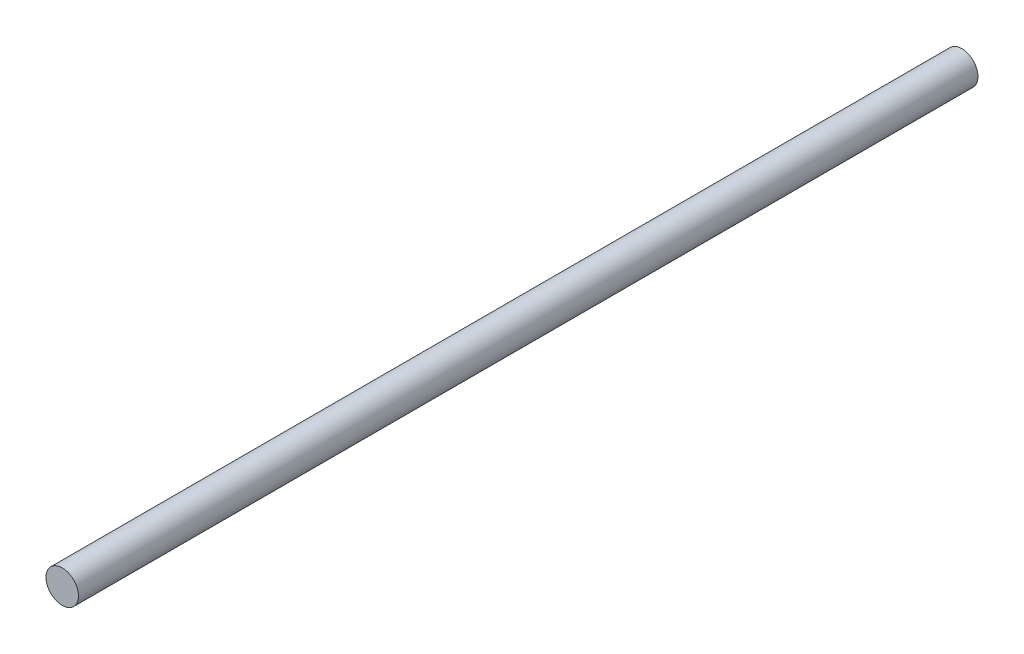
ISO-10303-21;
HEADER;
FILE_DESCRIPTION(('STEP AP214'),'2;1');
FILE_NAME('part.step','',(''),(''),'','','');
FILE_SCHEMA(('AUTOMOTIVE_DESIGN { 1 0 10303 214 1 1 1 1 }'));
ENDSEC;
DATA;
#1=APPLICATION_CONTEXT('core data for automotive mechanical design processes');
#2=APPLICATION_PROTOCOL_DEFINITION('international standard','automotive_design',2000,#1);
#3=PRODUCT_CONTEXT('',#1,'mechanical');
#4=PRODUCT('Part','Part','',(#3));
#5=PRODUCT_RELATED_PRODUCT_CATEGORY('part','',(#4));
#6=PRODUCT_DEFINITION_FORMATION('','',#4);
#7=PRODUCT_DEFINITION_CONTEXT('part definition',#1,'design');
#8=PRODUCT_DEFINITION('design','',#6,#7);
#9=PRODUCT_DEFINITION_SHAPE('','',#8);
#10=(LENGTH_UNIT() NAMED_UNIT(*) SI_UNIT(.MILLI.,.METRE.));
#11=(NAMED_UNIT(*) PLANE_ANGLE_UNIT() SI_UNIT($,.RADIAN.));
#12=(NAMED_UNIT(*) SI_UNIT($,.STERADIAN.) SOLID_ANGLE_UNIT());
#13=UNCERTAINTY_MEASURE_WITH_UNIT(LENGTH_MEASURE(1.E-05),#10,'distance_accuracy_value','');
#14=(GEOMETRIC_REPRESENTATION_CONTEXT(3) GLOBAL_UNCERTAINTY_ASSIGNED_CONTEXT((#13)) GLOBAL_UNIT_ASSIGNED_CONTEXT((#10,
#11,#12)) REPRESENTATION_CONTEXT('',''));
#15=CARTESIAN_POINT('',(0.,0.,0.));
#16=DIRECTION('',(0.,0.,1.));
#17=DIRECTION('',(1.,0.,0.));
#18=AXIS2_PLACEMENT_3D('',#15,#16,#17);
#19=CARTESIAN_POINT('',(0.,0.,83.));
#20=DIRECTION('',(0.,0.,-1.));
#21=DIRECTION('',(-1.,0.,0.));
#22=AXIS2_PLACEMENT_3D('',#19,#20,#21);
#23=CYLINDRICAL_SURFACE('',#22,1.5);
#24=CARTESIAN_POINT('',(0.,0.,83.));
#25=DIRECTION('',(0.,0.,1.));
#26=DIRECTION('',(1.,0.,0.));
#27=AXIS2_PLACEMENT_3D('',#24,#25,#26);
#28=CIRCLE('',#27,1.5);
#29=CARTESIAN_POINT('',(1.5,0.,83.));
#30=VERTEX_POINT('',#29);
#31=EDGE_CURVE('E10',#30,#30,#28,.T.);
#32=ORIENTED_EDGE('',*,*,#31,.F.);
#33=EDGE_LOOP('',(#32));
#34=FACE_BOUND('',#33,.T.);
#35=CARTESIAN_POINT('',(0.,0.,0.));
#36=DIRECTION('',(0.,0.,1.));
#37=DIRECTION('',(1.,0.,0.));
#38=AXIS2_PLACEMENT_3D('',#35,#36,#37);
#39=CIRCLE('',#38,1.5);
#40=CARTESIAN_POINT('',(1.5,0.,0.));
#41=VERTEX_POINT('',#40);
#42=EDGE_CURVE('E44',#41,#41,#39,.T.);
#43=ORIENTED_EDGE('',*,*,#42,.T.);
#44=EDGE_LOOP('',(#43));
#45=FACE_BOUND('',#44,.T.);
#46=ADVANCED_FACE('F41',(#34,#45),#23,.T.);
#47=CARTESIAN_POINT('',(0.,0.,83.));
#48=DIRECTION('',(0.,0.,1.));
#49=DIRECTION('',(1.,0.,0.));
#50=AXIS2_PLACEMENT_3D('',#47,#48,#49);
#51=PLANE('',#50);
#52=ORIENTED_EDGE('',*,*,#31,.T.);
#53=EDGE_LOOP('',(#52));
#54=FACE_BOUND('',#53,.T.);
#55=ADVANCED_FACE('F56',(#54),#51,.T.);
#56=CARTESIAN_POINT('',(0.,0.,0.));
#57=DIRECTION('',(0.,0.,1.));
#58=DIRECTION('',(1.,0.,0.));
#59=AXIS2_PLACEMENT_3D('',#56,#57,#58);
#60=PLANE('',#59);
#61=ORIENTED_EDGE('',*,*,#42,.F.);
#62=EDGE_LOOP('',(#61));
#63=FACE_BOUND('',#62,.T.);
#64=ADVANCED_FACE('F54',(#63),#60,.F.);
#65=CLOSED_SHELL('',(#46,#55,#64));
#66=MANIFOLD_SOLID_BREP('B2',#65);
#67=ADVANCED_BREP_SHAPE_REPRESENTATION('',(#18,#66),#14);
#68=SHAPE_DEFINITION_REPRESENTATION(#9,#67);
ENDSEC;
END-ISO-10303-21;
